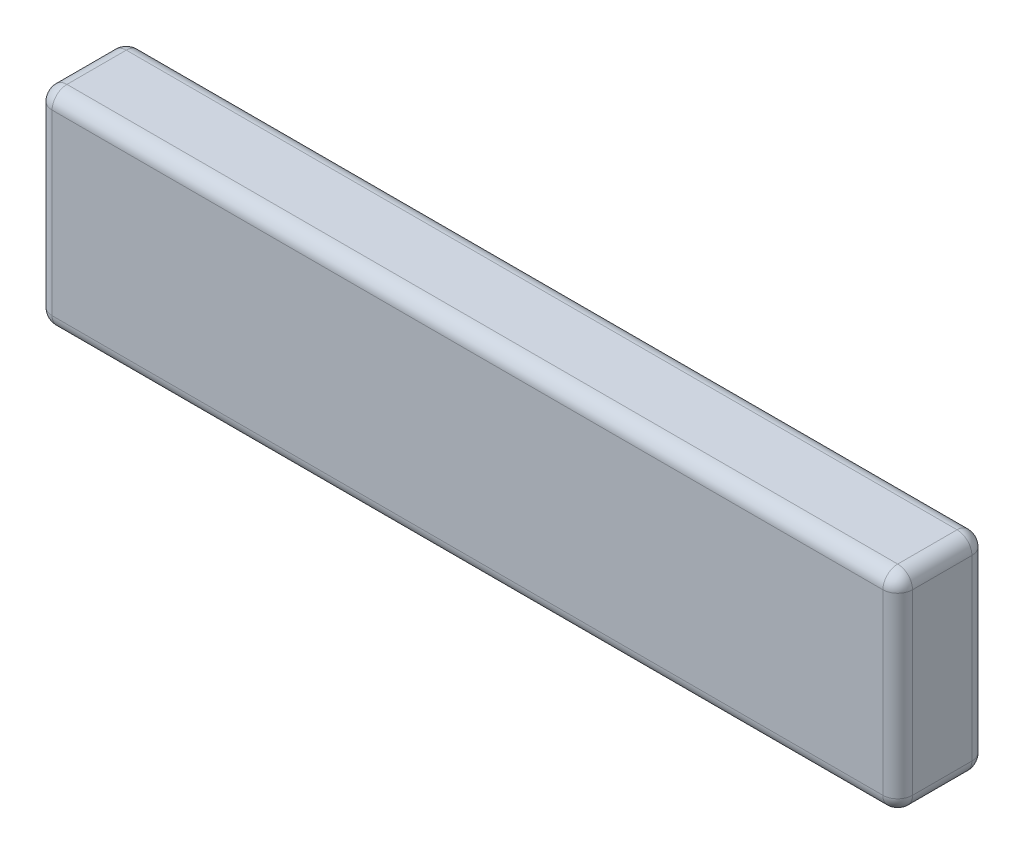
ISO-10303-21;
HEADER;
FILE_DESCRIPTION(('STEP AP214'),'2;1');
FILE_NAME('part.step','',(''),(''),'','','');
FILE_SCHEMA(('AUTOMOTIVE_DESIGN { 1 0 10303 214 1 1 1 1 }'));
ENDSEC;
DATA;
#1=APPLICATION_CONTEXT('core data for automotive mechanical design processes');
#2=APPLICATION_PROTOCOL_DEFINITION('international standard','automotive_design',2000,#1);
#3=PRODUCT_CONTEXT('',#1,'mechanical');
#4=PRODUCT('Part','Part','',(#3));
#5=PRODUCT_RELATED_PRODUCT_CATEGORY('part','',(#4));
#6=PRODUCT_DEFINITION_FORMATION('','',#4);
#7=PRODUCT_DEFINITION_CONTEXT('part definition',#1,'design');
#8=PRODUCT_DEFINITION('design','',#6,#7);
#9=PRODUCT_DEFINITION_SHAPE('','',#8);
#10=(LENGTH_UNIT() NAMED_UNIT(*) SI_UNIT(.MILLI.,.METRE.));
#11=(NAMED_UNIT(*) PLANE_ANGLE_UNIT() SI_UNIT($,.RADIAN.));
#12=(NAMED_UNIT(*) SI_UNIT($,.STERADIAN.) SOLID_ANGLE_UNIT());
#13=UNCERTAINTY_MEASURE_WITH_UNIT(LENGTH_MEASURE(1.E-05),#10,'distance_accuracy_value','');
#14=(GEOMETRIC_REPRESENTATION_CONTEXT(3) GLOBAL_UNCERTAINTY_ASSIGNED_CONTEXT((#13)) GLOBAL_UNIT_ASSIGNED_CONTEXT((#10,
#11,#12)) REPRESENTATION_CONTEXT('',''));
#15=CARTESIAN_POINT('',(0.,0.,0.));
#16=DIRECTION('',(0.,0.,1.));
#17=DIRECTION('',(1.,0.,0.));
#18=AXIS2_PLACEMENT_3D('',#15,#16,#17);
#19=CARTESIAN_POINT('',(11.4400713575457,0.,0.));
#20=DIRECTION('',(1.,0.,0.));
#21=DIRECTION('',(0.,0.,-1.));
#22=AXIS2_PLACEMENT_3D('',#19,#20,#21);
#23=PLANE('',#22);
#24=DIRECTION('',(0.,0.,-1.));
#25=VECTOR('',#24,1.);
#26=CARTESIAN_POINT('',(11.4400713575457,148.074028512687,0.));
#27=LINE('',#26,#25);
#28=CARTESIAN_POINT('',(11.4400713575457,148.074028512687,37.7935567964382));
#29=VERTEX_POINT('',#28);
#30=CARTESIAN_POINT('',(11.4400713575457,148.074028512687,39.7935567964381));
#31=VERTEX_POINT('',#30);
#32=EDGE_CURVE('E50',#29,#31,#27,.F.);
#33=ORIENTED_EDGE('',*,*,#32,.T.);
#34=DIRECTION('',(0.,-1.,0.));
#35=VECTOR('',#34,1.);
#36=CARTESIAN_POINT('',(11.4400713575457,0.,39.7935567964381));
#37=LINE('',#36,#35);
#38=CARTESIAN_POINT('',(11.4400713575457,154.074028512687,39.7935567964381));
#39=VERTEX_POINT('',#38);
#40=EDGE_CURVE('E11',#31,#39,#37,.F.);
#41=ORIENTED_EDGE('',*,*,#40,.T.);
#42=DIRECTION('',(0.,0.,1.));
#43=VECTOR('',#42,1.);
#44=CARTESIAN_POINT('',(11.4400713575457,154.074028512687,0.));
#45=LINE('',#44,#43);
#46=CARTESIAN_POINT('',(11.4400713575457,154.074028512687,37.7935567964382));
#47=VERTEX_POINT('',#46);
#48=EDGE_CURVE('E201',#39,#47,#45,.F.);
#49=ORIENTED_EDGE('',*,*,#48,.T.);
#50=DIRECTION('',(0.,1.,0.));
#51=VECTOR('',#50,1.);
#52=CARTESIAN_POINT('',(11.4400713575457,0.,37.7935567964382));
#53=LINE('',#52,#51);
#54=EDGE_CURVE('E61',#47,#29,#53,.F.);
#55=ORIENTED_EDGE('',*,*,#54,.T.);
#56=EDGE_LOOP('',(#33,#41,#49,#55));
#57=FACE_BOUND('',#56,.T.);
#58=ADVANCED_FACE('F41',(#57),#23,.F.);
#59=CARTESIAN_POINT('',(48.0558444634096,154.574028512687,42.7935567964381));
#60=DIRECTION('',(0.,-1.,0.));
#61=DIRECTION('',(0.,0.,-1.));
#62=AXIS2_PLACEMENT_3D('',#59,#60,#61);
#63=PLANE('',#62);
#64=DIRECTION('',(-1.,0.,0.));
#65=VECTOR('',#64,1.);
#66=CARTESIAN_POINT('',(48.0558444634096,154.574028512687,39.7935567964381));
#67=LINE('',#66,#65);
#68=CARTESIAN_POINT('',(11.9400713575457,154.574028512687,39.7935567964381));
#69=VERTEX_POINT('',#68);
#70=CARTESIAN_POINT('',(39.9400713575457,154.574028512687,39.7935567964381));
#71=VERTEX_POINT('',#70);
#72=EDGE_CURVE('E182',#69,#71,#67,.F.);
#73=ORIENTED_EDGE('',*,*,#72,.T.);
#74=DIRECTION('',(0.,0.,-1.));
#75=VECTOR('',#74,1.);
#76=CARTESIAN_POINT('',(39.9400713575457,154.574028512687,42.7935567964381));
#77=LINE('',#76,#75);
#78=CARTESIAN_POINT('',(39.9400713575457,154.574028512687,37.7935567964382));
#79=VERTEX_POINT('',#78);
#80=EDGE_CURVE('E211',#71,#79,#77,.T.);
#81=ORIENTED_EDGE('',*,*,#80,.T.);
#82=DIRECTION('',(-1.,0.,0.));
#83=VECTOR('',#82,1.);
#84=CARTESIAN_POINT('',(48.0558444634096,154.574028512687,37.7935567964382));
#85=LINE('',#84,#83);
#86=CARTESIAN_POINT('',(11.9400713575457,154.574028512687,37.7935567964382));
#87=VERTEX_POINT('',#86);
#88=EDGE_CURVE('E251',#79,#87,#85,.T.);
#89=ORIENTED_EDGE('',*,*,#88,.T.);
#90=DIRECTION('',(0.,0.,1.));
#91=VECTOR('',#90,1.);
#92=CARTESIAN_POINT('',(11.9400713575457,154.574028512687,42.7935567964381));
#93=LINE('',#92,#91);
#94=EDGE_CURVE('E213',#87,#69,#93,.T.);
#95=ORIENTED_EDGE('',*,*,#94,.T.);
#96=EDGE_LOOP('',(#73,#81,#89,#95));
#97=FACE_BOUND('',#96,.T.);
#98=ADVANCED_FACE('F258',(#97),#63,.F.);
#99=CARTESIAN_POINT('',(48.0558444634096,-16.4259714873127,37.2935567964382));
#100=DIRECTION('',(0.,0.,1.));
#101=DIRECTION('',(1.,0.,0.));
#102=AXIS2_PLACEMENT_3D('',#99,#100,#101);
#103=PLANE('',#102);
#104=DIRECTION('',(-1.,0.,0.));
#105=VECTOR('',#104,1.);
#106=CARTESIAN_POINT('',(48.0558444634096,154.074028512687,37.2935567964382));
#107=LINE('',#106,#105);
#108=CARTESIAN_POINT('',(11.9400713575457,154.074028512687,37.2935567964382));
#109=VERTEX_POINT('',#108);
#110=CARTESIAN_POINT('',(39.9400713575457,154.074028512687,37.2935567964382));
#111=VERTEX_POINT('',#110);
#112=EDGE_CURVE('E246',#109,#111,#107,.F.);
#113=ORIENTED_EDGE('',*,*,#112,.T.);
#114=DIRECTION('',(0.,-1.,0.));
#115=VECTOR('',#114,1.);
#116=CARTESIAN_POINT('',(39.9400713575457,-16.4259714873127,37.2935567964382));
#117=LINE('',#116,#115);
#118=CARTESIAN_POINT('',(39.9400713575457,148.074028512687,37.2935567964382));
#119=VERTEX_POINT('',#118);
#120=EDGE_CURVE('E203',#111,#119,#117,.T.);
#121=ORIENTED_EDGE('',*,*,#120,.T.);
#122=DIRECTION('',(-1.,0.,0.));
#123=VECTOR('',#122,1.);
#124=CARTESIAN_POINT('',(48.0558444634096,148.074028512687,37.2935567964382));
#125=LINE('',#124,#123);
#126=CARTESIAN_POINT('',(11.9400713575457,148.074028512687,37.2935567964382));
#127=VERTEX_POINT('',#126);
#128=EDGE_CURVE('E249',#119,#127,#125,.T.);
#129=ORIENTED_EDGE('',*,*,#128,.T.);
#130=DIRECTION('',(0.,1.,0.));
#131=VECTOR('',#130,1.);
#132=CARTESIAN_POINT('',(11.9400713575457,-16.4259714873127,37.2935567964382));
#133=LINE('',#132,#131);
#134=EDGE_CURVE('E205',#127,#109,#133,.T.);
#135=ORIENTED_EDGE('',*,*,#134,.T.);
#136=EDGE_LOOP('',(#113,#121,#129,#135));
#137=FACE_BOUND('',#136,.T.);
#138=ADVANCED_FACE('F283',(#137),#103,.F.);
#139=CARTESIAN_POINT('',(48.0558444634096,147.574028512687,42.7935567964381));
#140=DIRECTION('',(0.,1.,0.));
#141=DIRECTION('',(0.,0.,1.));
#142=AXIS2_PLACEMENT_3D('',#139,#140,#141);
#143=PLANE('',#142);
#144=DIRECTION('',(-1.,0.,0.));
#145=VECTOR('',#144,1.);
#146=CARTESIAN_POINT('',(48.0558444634096,147.574028512687,37.7935567964382));
#147=LINE('',#146,#145);
#148=CARTESIAN_POINT('',(11.9400713575457,147.574028512687,37.7935567964382));
#149=VERTEX_POINT('',#148);
#150=CARTESIAN_POINT('',(39.9400713575457,147.574028512687,37.7935567964382));
#151=VERTEX_POINT('',#150);
#152=EDGE_CURVE('E134',#149,#151,#147,.F.);
#153=ORIENTED_EDGE('',*,*,#152,.T.);
#154=DIRECTION('',(0.,0.,1.));
#155=VECTOR('',#154,1.);
#156=CARTESIAN_POINT('',(39.9400713575457,147.574028512687,42.7935567964381));
#157=LINE('',#156,#155);
#158=CARTESIAN_POINT('',(39.9400713575457,147.574028512687,39.7935567964381));
#159=VERTEX_POINT('',#158);
#160=EDGE_CURVE('E140',#151,#159,#157,.T.);
#161=ORIENTED_EDGE('',*,*,#160,.T.);
#162=DIRECTION('',(-1.,0.,0.));
#163=VECTOR('',#162,1.);
#164=CARTESIAN_POINT('',(48.0558444634096,147.574028512687,39.7935567964381));
#165=LINE('',#164,#163);
#166=CARTESIAN_POINT('',(11.9400713575457,147.574028512687,39.7935567964381));
#167=VERTEX_POINT('',#166);
#168=EDGE_CURVE('E136',#159,#167,#165,.T.);
#169=ORIENTED_EDGE('',*,*,#168,.T.);
#170=DIRECTION('',(0.,0.,-1.));
#171=VECTOR('',#170,1.);
#172=CARTESIAN_POINT('',(11.9400713575457,147.574028512687,42.7935567964381));
#173=LINE('',#172,#171);
#174=EDGE_CURVE('E131',#167,#149,#173,.T.);
#175=ORIENTED_EDGE('',*,*,#174,.T.);
#176=EDGE_LOOP('',(#153,#161,#169,#175));
#177=FACE_BOUND('',#176,.T.);
#178=ADVANCED_FACE('F133',(#177),#143,.F.);
#179=CARTESIAN_POINT('',(48.0558444634096,-16.4259714873127,40.2935567964381));
#180=DIRECTION('',(0.,0.,-1.));
#181=DIRECTION('',(-1.,0.,0.));
#182=AXIS2_PLACEMENT_3D('',#179,#180,#181);
#183=PLANE('',#182);
#184=DIRECTION('',(-1.,0.,0.));
#185=VECTOR('',#184,1.);
#186=CARTESIAN_POINT('',(48.0558444634096,148.074028512687,40.2935567964381));
#187=LINE('',#186,#185);
#188=CARTESIAN_POINT('',(11.9400713575457,148.074028512687,40.2935567964381));
#189=VERTEX_POINT('',#188);
#190=CARTESIAN_POINT('',(39.9400713575457,148.074028512687,40.2935567964381));
#191=VERTEX_POINT('',#190);
#192=EDGE_CURVE('E243',#189,#191,#187,.F.);
#193=ORIENTED_EDGE('',*,*,#192,.T.);
#194=DIRECTION('',(0.,1.,0.));
#195=VECTOR('',#194,1.);
#196=CARTESIAN_POINT('',(39.9400713575457,-16.4259714873127,40.2935567964381));
#197=LINE('',#196,#195);
#198=CARTESIAN_POINT('',(39.9400713575457,154.074028512687,40.2935567964381));
#199=VERTEX_POINT('',#198);
#200=EDGE_CURVE('E220',#191,#199,#197,.T.);
#201=ORIENTED_EDGE('',*,*,#200,.T.);
#202=DIRECTION('',(-1.,0.,0.));
#203=VECTOR('',#202,1.);
#204=CARTESIAN_POINT('',(48.0558444634096,154.074028512687,40.2935567964381));
#205=LINE('',#204,#203);
#206=CARTESIAN_POINT('',(11.9400713575457,154.074028512687,40.2935567964381));
#207=VERTEX_POINT('',#206);
#208=EDGE_CURVE('E240',#199,#207,#205,.T.);
#209=ORIENTED_EDGE('',*,*,#208,.T.);
#210=DIRECTION('',(0.,-1.,0.));
#211=VECTOR('',#210,1.);
#212=CARTESIAN_POINT('',(11.9400713575457,-16.4259714873127,40.2935567964381));
#213=LINE('',#212,#211);
#214=EDGE_CURVE('E222',#207,#189,#213,.T.);
#215=ORIENTED_EDGE('',*,*,#214,.T.);
#216=EDGE_LOOP('',(#193,#201,#209,#215));
#217=FACE_BOUND('',#216,.T.);
#218=ADVANCED_FACE('F305',(#217),#183,.F.);
#219=CARTESIAN_POINT('',(40.4400713575457,-16.4259714873127,42.7935567964381));
#220=DIRECTION('',(-1.,0.,0.));
#221=DIRECTION('',(0.,0.,1.));
#222=AXIS2_PLACEMENT_3D('',#219,#220,#221);
#223=PLANE('',#222);
#224=DIRECTION('',(0.,1.,0.));
#225=VECTOR('',#224,1.);
#226=CARTESIAN_POINT('',(40.4400713575457,-16.4259714873127,39.7935567964381));
#227=LINE('',#226,#225);
#228=CARTESIAN_POINT('',(40.4400713575457,154.074028512687,39.7935567964381));
#229=VERTEX_POINT('',#228);
#230=CARTESIAN_POINT('',(40.4400713575457,148.074028512687,39.7935567964381));
#231=VERTEX_POINT('',#230);
#232=EDGE_CURVE('E231',#229,#231,#227,.F.);
#233=ORIENTED_EDGE('',*,*,#232,.T.);
#234=DIRECTION('',(0.,0.,1.));
#235=VECTOR('',#234,1.);
#236=CARTESIAN_POINT('',(40.4400713575457,148.074028512687,42.7935567964381));
#237=LINE('',#236,#235);
#238=CARTESIAN_POINT('',(40.4400713575457,148.074028512687,37.7935567964382));
#239=VERTEX_POINT('',#238);
#240=EDGE_CURVE('E228',#231,#239,#237,.F.);
#241=ORIENTED_EDGE('',*,*,#240,.T.);
#242=DIRECTION('',(0.,-1.,0.));
#243=VECTOR('',#242,1.);
#244=CARTESIAN_POINT('',(40.4400713575457,-16.4259714873127,37.7935567964382));
#245=LINE('',#244,#243);
#246=CARTESIAN_POINT('',(40.4400713575457,154.074028512687,37.7935567964382));
#247=VERTEX_POINT('',#246);
#248=EDGE_CURVE('E235',#239,#247,#245,.F.);
#249=ORIENTED_EDGE('',*,*,#248,.T.);
#250=DIRECTION('',(0.,0.,-1.));
#251=VECTOR('',#250,1.);
#252=CARTESIAN_POINT('',(40.4400713575457,154.074028512687,42.7935567964381));
#253=LINE('',#252,#251);
#254=EDGE_CURVE('E233',#247,#229,#253,.F.);
#255=ORIENTED_EDGE('',*,*,#254,.T.);
#256=EDGE_LOOP('',(#233,#241,#249,#255));
#257=FACE_BOUND('',#256,.T.);
#258=ADVANCED_FACE('F321',(#257),#223,.F.);
#259=CARTESIAN_POINT('',(48.0558444634096,154.074028512687,37.7935567964382));
#260=DIRECTION('',(-1.,0.,0.));
#261=DIRECTION('',(0.,0.,1.));
#262=AXIS2_PLACEMENT_3D('',#259,#260,#261);
#263=CYLINDRICAL_SURFACE('',#262,0.5);
#264=ORIENTED_EDGE('',*,*,#88,.F.);
#265=CARTESIAN_POINT('',(39.9400713575457,154.074028512687,37.7935567964382));
#266=DIRECTION('',(-1.,0.,0.));
#267=DIRECTION('',(0.,0.,1.));
#268=AXIS2_PLACEMENT_3D('',#265,#266,#267);
#269=CIRCLE('',#268,0.5);
#270=EDGE_CURVE('E207',#79,#111,#269,.T.);
#271=ORIENTED_EDGE('',*,*,#270,.T.);
#272=ORIENTED_EDGE('',*,*,#112,.F.);
#273=CARTESIAN_POINT('',(11.9400713575457,154.074028512687,37.7935567964382));
#274=DIRECTION('',(-1.,0.,0.));
#275=DIRECTION('',(0.,0.,1.));
#276=AXIS2_PLACEMENT_3D('',#273,#274,#275);
#277=CIRCLE('',#276,0.5);
#278=EDGE_CURVE('E209',#109,#87,#277,.F.);
#279=ORIENTED_EDGE('',*,*,#278,.T.);
#280=EDGE_LOOP('',(#264,#271,#272,#279));
#281=FACE_BOUND('',#280,.T.);
#282=ADVANCED_FACE('F280',(#281),#263,.T.);
#283=CARTESIAN_POINT('',(48.0558444634096,154.074028512687,39.7935567964381));
#284=DIRECTION('',(-1.,0.,0.));
#285=DIRECTION('',(0.,0.,1.));
#286=AXIS2_PLACEMENT_3D('',#283,#284,#285);
#287=CYLINDRICAL_SURFACE('',#286,0.5);
#288=ORIENTED_EDGE('',*,*,#208,.F.);
#289=CARTESIAN_POINT('',(39.9400713575457,154.074028512687,39.7935567964381));
#290=DIRECTION('',(-1.,0.,0.));
#291=DIRECTION('',(0.,0.,1.));
#292=AXIS2_PLACEMENT_3D('',#289,#290,#291);
#293=CIRCLE('',#292,0.5);
#294=EDGE_CURVE('E215',#199,#71,#293,.T.);
#295=ORIENTED_EDGE('',*,*,#294,.T.);
#296=ORIENTED_EDGE('',*,*,#72,.F.);
#297=CARTESIAN_POINT('',(11.9400713575457,154.074028512687,39.7935567964381));
#298=DIRECTION('',(-1.,0.,0.));
#299=DIRECTION('',(0.,0.,1.));
#300=AXIS2_PLACEMENT_3D('',#297,#298,#299);
#301=CIRCLE('',#300,0.5);
#302=EDGE_CURVE('E217',#69,#207,#301,.F.);
#303=ORIENTED_EDGE('',*,*,#302,.T.);
#304=EDGE_LOOP('',(#288,#295,#296,#303));
#305=FACE_BOUND('',#304,.T.);
#306=ADVANCED_FACE('F304',(#305),#287,.T.);
#307=CARTESIAN_POINT('',(48.0558444634096,148.074028512687,37.7935567964382));
#308=DIRECTION('',(-1.,0.,0.));
#309=DIRECTION('',(0.,0.,1.));
#310=AXIS2_PLACEMENT_3D('',#307,#308,#309);
#311=CYLINDRICAL_SURFACE('',#310,0.5);
#312=ORIENTED_EDGE('',*,*,#128,.F.);
#313=CARTESIAN_POINT('',(39.9400713575457,148.074028512687,37.7935567964382));
#314=DIRECTION('',(-1.,0.,0.));
#315=DIRECTION('',(0.,0.,1.));
#316=AXIS2_PLACEMENT_3D('',#313,#314,#315);
#317=CIRCLE('',#316,0.5);
#318=EDGE_CURVE('E141',#119,#151,#317,.T.);
#319=ORIENTED_EDGE('',*,*,#318,.T.);
#320=ORIENTED_EDGE('',*,*,#152,.F.);
#321=CARTESIAN_POINT('',(11.9400713575457,148.074028512687,37.7935567964382));
#322=DIRECTION('',(-1.,0.,0.));
#323=DIRECTION('',(0.,0.,1.));
#324=AXIS2_PLACEMENT_3D('',#321,#322,#323);
#325=CIRCLE('',#324,0.5);
#326=EDGE_CURVE('E148',#149,#127,#325,.F.);
#327=ORIENTED_EDGE('',*,*,#326,.T.);
#328=EDGE_LOOP('',(#312,#319,#320,#327));
#329=FACE_BOUND('',#328,.T.);
#330=ADVANCED_FACE('F147',(#329),#311,.T.);
#331=CARTESIAN_POINT('',(48.0558444634096,148.074028512687,39.7935567964381));
#332=DIRECTION('',(-1.,0.,0.));
#333=DIRECTION('',(0.,0.,1.));
#334=AXIS2_PLACEMENT_3D('',#331,#332,#333);
#335=CYLINDRICAL_SURFACE('',#334,0.5);
#336=ORIENTED_EDGE('',*,*,#168,.F.);
#337=CARTESIAN_POINT('',(39.9400713575457,148.074028512687,39.7935567964381));
#338=DIRECTION('',(-1.,0.,0.));
#339=DIRECTION('',(0.,0.,1.));
#340=AXIS2_PLACEMENT_3D('',#337,#338,#339);
#341=CIRCLE('',#340,0.5);
#342=EDGE_CURVE('E224',#159,#191,#341,.T.);
#343=ORIENTED_EDGE('',*,*,#342,.T.);
#344=ORIENTED_EDGE('',*,*,#192,.F.);
#345=CARTESIAN_POINT('',(11.9400713575457,148.074028512687,39.7935567964381));
#346=DIRECTION('',(-1.,0.,0.));
#347=DIRECTION('',(0.,0.,1.));
#348=AXIS2_PLACEMENT_3D('',#345,#346,#347);
#349=CIRCLE('',#348,0.5);
#350=EDGE_CURVE('E226',#189,#167,#349,.F.);
#351=ORIENTED_EDGE('',*,*,#350,.T.);
#352=EDGE_LOOP('',(#336,#343,#344,#351));
#353=FACE_BOUND('',#352,.T.);
#354=ADVANCED_FACE('F328',(#353),#335,.T.);
#355=CARTESIAN_POINT('',(39.9400713575457,154.074028512687,39.7935567964381));
#356=DIRECTION('',(-1.,0.,0.));
#357=DIRECTION('',(0.,0.,1.));
#358=AXIS2_PLACEMENT_3D('',#355,#356,#357);
#359=SPHERICAL_SURFACE('',#358,0.5);
#360=CARTESIAN_POINT('',(39.9400713575457,154.074028512687,39.7935567964381));
#361=DIRECTION('',(0.,0.,-1.));
#362=DIRECTION('',(-1.,0.,0.));
#363=AXIS2_PLACEMENT_3D('',#360,#361,#362);
#364=CIRCLE('',#363,0.5);
#365=EDGE_CURVE('E183',#71,#229,#364,.T.);
#366=ORIENTED_EDGE('',*,*,#365,.F.);
#367=ORIENTED_EDGE('',*,*,#294,.F.);
#368=CARTESIAN_POINT('',(39.9400713575457,154.074028512687,39.7935567964381));
#369=DIRECTION('',(0.,-1.,0.));
#370=DIRECTION('',(0.,0.,-1.));
#371=AXIS2_PLACEMENT_3D('',#368,#369,#370);
#372=CIRCLE('',#371,0.5);
#373=EDGE_CURVE('E179',#229,#199,#372,.T.);
#374=ORIENTED_EDGE('',*,*,#373,.F.);
#375=EDGE_LOOP('',(#366,#367,#374));
#376=FACE_BOUND('',#375,.T.);
#377=ADVANCED_FACE('F267',(#376),#359,.T.);
#378=CARTESIAN_POINT('',(39.9400713575457,-16.4259714873127,39.7935567964381));
#379=DIRECTION('',(0.,1.,0.));
#380=DIRECTION('',(0.,0.,1.));
#381=AXIS2_PLACEMENT_3D('',#378,#379,#380);
#382=CYLINDRICAL_SURFACE('',#381,0.5);
#383=ORIENTED_EDGE('',*,*,#373,.T.);
#384=ORIENTED_EDGE('',*,*,#200,.F.);
#385=CARTESIAN_POINT('',(39.9400713575457,148.074028512687,39.7935567964381));
#386=DIRECTION('',(0.,-1.,0.));
#387=DIRECTION('',(0.,0.,-1.));
#388=AXIS2_PLACEMENT_3D('',#385,#386,#387);
#389=CIRCLE('',#388,0.5);
#390=EDGE_CURVE('E186',#231,#191,#389,.T.);
#391=ORIENTED_EDGE('',*,*,#390,.F.);
#392=ORIENTED_EDGE('',*,*,#232,.F.);
#393=EDGE_LOOP('',(#383,#384,#391,#392));
#394=FACE_BOUND('',#393,.T.);
#395=ADVANCED_FACE('F309',(#394),#382,.T.);
#396=CARTESIAN_POINT('',(39.9400713575457,154.074028512687,42.7935567964381));
#397=DIRECTION('',(0.,0.,-1.));
#398=DIRECTION('',(-1.,0.,0.));
#399=AXIS2_PLACEMENT_3D('',#396,#397,#398);
#400=CYLINDRICAL_SURFACE('',#399,0.5);
#401=ORIENTED_EDGE('',*,*,#365,.T.);
#402=ORIENTED_EDGE('',*,*,#254,.F.);
#403=CARTESIAN_POINT('',(39.9400713575457,154.074028512687,37.7935567964382));
#404=DIRECTION('',(0.,0.,-1.));
#405=DIRECTION('',(-1.,0.,0.));
#406=AXIS2_PLACEMENT_3D('',#403,#404,#405);
#407=CIRCLE('',#406,0.5);
#408=EDGE_CURVE('E189',#79,#247,#407,.T.);
#409=ORIENTED_EDGE('',*,*,#408,.F.);
#410=ORIENTED_EDGE('',*,*,#80,.F.);
#411=EDGE_LOOP('',(#401,#402,#409,#410));
#412=FACE_BOUND('',#411,.T.);
#413=ADVANCED_FACE('F272',(#412),#400,.T.);
#414=CARTESIAN_POINT('',(39.9400713575457,148.074028512687,39.7935567964381));
#415=DIRECTION('',(-1.,0.,0.));
#416=DIRECTION('',(0.,0.,1.));
#417=AXIS2_PLACEMENT_3D('',#414,#415,#416);
#418=SPHERICAL_SURFACE('',#417,0.5);
#419=ORIENTED_EDGE('',*,*,#390,.T.);
#420=ORIENTED_EDGE('',*,*,#342,.F.);
#421=CARTESIAN_POINT('',(39.9400713575457,148.074028512687,39.7935567964381));
#422=DIRECTION('',(0.,0.,-1.));
#423=DIRECTION('',(-1.,0.,0.));
#424=AXIS2_PLACEMENT_3D('',#421,#422,#423);
#425=CIRCLE('',#424,0.5);
#426=EDGE_CURVE('E192',#231,#159,#425,.T.);
#427=ORIENTED_EDGE('',*,*,#426,.F.);
#428=EDGE_LOOP('',(#419,#420,#427));
#429=FACE_BOUND('',#428,.T.);
#430=ADVANCED_FACE('F313',(#429),#418,.T.);
#431=CARTESIAN_POINT('',(39.9400713575457,154.074028512687,37.7935567964382));
#432=DIRECTION('',(-1.,0.,0.));
#433=DIRECTION('',(0.,0.,1.));
#434=AXIS2_PLACEMENT_3D('',#431,#432,#433);
#435=SPHERICAL_SURFACE('',#434,0.5);
#436=ORIENTED_EDGE('',*,*,#270,.F.);
#437=ORIENTED_EDGE('',*,*,#408,.T.);
#438=CARTESIAN_POINT('',(39.9400713575457,154.074028512687,37.7935567964382));
#439=DIRECTION('',(0.,-1.,0.));
#440=DIRECTION('',(0.,0.,-1.));
#441=AXIS2_PLACEMENT_3D('',#438,#439,#440);
#442=CIRCLE('',#441,0.5);
#443=EDGE_CURVE('E195',#111,#247,#442,.T.);
#444=ORIENTED_EDGE('',*,*,#443,.F.);
#445=EDGE_LOOP('',(#436,#437,#444));
#446=FACE_BOUND('',#445,.T.);
#447=ADVANCED_FACE('F276',(#446),#435,.T.);
#448=CARTESIAN_POINT('',(39.9400713575457,148.074028512687,42.7935567964381));
#449=DIRECTION('',(0.,0.,1.));
#450=DIRECTION('',(1.,0.,0.));
#451=AXIS2_PLACEMENT_3D('',#448,#449,#450);
#452=CYLINDRICAL_SURFACE('',#451,0.5);
#453=ORIENTED_EDGE('',*,*,#426,.T.);
#454=ORIENTED_EDGE('',*,*,#160,.F.);
#455=CARTESIAN_POINT('',(39.9400713575457,148.074028512687,37.7935567964382));
#456=DIRECTION('',(0.,0.,-1.));
#457=DIRECTION('',(-1.,0.,0.));
#458=AXIS2_PLACEMENT_3D('',#455,#456,#457);
#459=CIRCLE('',#458,0.5);
#460=EDGE_CURVE('E160',#239,#151,#459,.T.);
#461=ORIENTED_EDGE('',*,*,#460,.F.);
#462=ORIENTED_EDGE('',*,*,#240,.F.);
#463=EDGE_LOOP('',(#453,#454,#461,#462));
#464=FACE_BOUND('',#463,.T.);
#465=ADVANCED_FACE('F318',(#464),#452,.T.);
#466=CARTESIAN_POINT('',(39.9400713575457,-16.4259714873127,37.7935567964382));
#467=DIRECTION('',(0.,-1.,0.));
#468=DIRECTION('',(0.,0.,-1.));
#469=AXIS2_PLACEMENT_3D('',#466,#467,#468);
#470=CYLINDRICAL_SURFACE('',#469,0.5);
#471=ORIENTED_EDGE('',*,*,#443,.T.);
#472=ORIENTED_EDGE('',*,*,#248,.F.);
#473=CARTESIAN_POINT('',(39.9400713575457,148.074028512687,37.7935567964382));
#474=DIRECTION('',(0.,-1.,0.));
#475=DIRECTION('',(0.,0.,-1.));
#476=AXIS2_PLACEMENT_3D('',#473,#474,#475);
#477=CIRCLE('',#476,0.5);
#478=EDGE_CURVE('E159',#119,#239,#477,.T.);
#479=ORIENTED_EDGE('',*,*,#478,.F.);
#480=ORIENTED_EDGE('',*,*,#120,.F.);
#481=EDGE_LOOP('',(#471,#472,#479,#480));
#482=FACE_BOUND('',#481,.T.);
#483=ADVANCED_FACE('F324',(#482),#470,.T.);
#484=CARTESIAN_POINT('',(39.9400713575457,148.074028512687,37.7935567964382));
#485=DIRECTION('',(-1.,0.,0.));
#486=DIRECTION('',(0.,0.,1.));
#487=AXIS2_PLACEMENT_3D('',#484,#485,#486);
#488=SPHERICAL_SURFACE('',#487,0.5);
#489=ORIENTED_EDGE('',*,*,#460,.T.);
#490=ORIENTED_EDGE('',*,*,#318,.F.);
#491=ORIENTED_EDGE('',*,*,#478,.T.);
#492=EDGE_LOOP('',(#489,#490,#491));
#493=FACE_BOUND('',#492,.T.);
#494=ADVANCED_FACE('F326',(#493),#488,.T.);
#495=CARTESIAN_POINT('',(11.9400713575457,148.074028512687,37.7935567964382));
#496=DIRECTION('',(1.,0.,0.));
#497=DIRECTION('',(0.,0.,-1.));
#498=AXIS2_PLACEMENT_3D('',#495,#496,#497);
#499=SPHERICAL_SURFACE('',#498,0.5);
#500=CARTESIAN_POINT('',(11.9400713575457,148.074028512687,37.7935567964382));
#501=DIRECTION('',(0.,1.,0.));
#502=DIRECTION('',(0.,0.,1.));
#503=AXIS2_PLACEMENT_3D('',#500,#501,#502);
#504=CIRCLE('',#503,0.5);
#505=EDGE_CURVE('E155',#127,#29,#504,.T.);
#506=ORIENTED_EDGE('',*,*,#505,.F.);
#507=ORIENTED_EDGE('',*,*,#326,.F.);
#508=CARTESIAN_POINT('',(11.9400713575457,148.074028512687,37.7935567964382));
#509=DIRECTION('',(0.,0.,1.));
#510=DIRECTION('',(1.,0.,0.));
#511=AXIS2_PLACEMENT_3D('',#508,#509,#510);
#512=CIRCLE('',#511,0.5);
#513=EDGE_CURVE('E45',#29,#149,#512,.T.);
#514=ORIENTED_EDGE('',*,*,#513,.F.);
#515=EDGE_LOOP('',(#506,#507,#514));
#516=FACE_BOUND('',#515,.T.);
#517=ADVANCED_FACE('F43',(#516),#499,.T.);
#518=CARTESIAN_POINT('',(11.9400713575457,148.074028512687,42.7935567964381));
#519=DIRECTION('',(0.,0.,-1.));
#520=DIRECTION('',(-1.,0.,0.));
#521=AXIS2_PLACEMENT_3D('',#518,#519,#520);
#522=CYLINDRICAL_SURFACE('',#521,0.5);
#523=ORIENTED_EDGE('',*,*,#513,.T.);
#524=ORIENTED_EDGE('',*,*,#174,.F.);
#525=CARTESIAN_POINT('',(11.9400713575457,148.074028512687,39.7935567964381));
#526=DIRECTION('',(0.,0.,1.));
#527=DIRECTION('',(1.,0.,0.));
#528=AXIS2_PLACEMENT_3D('',#525,#526,#527);
#529=CIRCLE('',#528,0.5);
#530=EDGE_CURVE('E162',#31,#167,#529,.T.);
#531=ORIENTED_EDGE('',*,*,#530,.F.);
#532=ORIENTED_EDGE('',*,*,#32,.F.);
#533=EDGE_LOOP('',(#523,#524,#531,#532));
#534=FACE_BOUND('',#533,.T.);
#535=ADVANCED_FACE('F158',(#534),#522,.T.);
#536=CARTESIAN_POINT('',(11.9400713575457,-16.4259714873127,37.7935567964382));
#537=DIRECTION('',(0.,1.,0.));
#538=DIRECTION('',(0.,0.,1.));
#539=AXIS2_PLACEMENT_3D('',#536,#537,#538);
#540=CYLINDRICAL_SURFACE('',#539,0.5);
#541=ORIENTED_EDGE('',*,*,#505,.T.);
#542=ORIENTED_EDGE('',*,*,#54,.F.);
#543=CARTESIAN_POINT('',(11.9400713575457,154.074028512687,37.7935567964382));
#544=DIRECTION('',(0.,1.,0.));
#545=DIRECTION('',(0.,0.,1.));
#546=AXIS2_PLACEMENT_3D('',#543,#544,#545);
#547=CIRCLE('',#546,0.5);
#548=EDGE_CURVE('E164',#109,#47,#547,.T.);
#549=ORIENTED_EDGE('',*,*,#548,.F.);
#550=ORIENTED_EDGE('',*,*,#134,.F.);
#551=EDGE_LOOP('',(#541,#542,#549,#550));
#552=FACE_BOUND('',#551,.T.);
#553=ADVANCED_FACE('F284',(#552),#540,.T.);
#554=CARTESIAN_POINT('',(11.9400713575457,148.074028512687,39.7935567964381));
#555=DIRECTION('',(1.,0.,0.));
#556=DIRECTION('',(0.,0.,-1.));
#557=AXIS2_PLACEMENT_3D('',#554,#555,#556);
#558=SPHERICAL_SURFACE('',#557,0.5);
#559=ORIENTED_EDGE('',*,*,#530,.T.);
#560=ORIENTED_EDGE('',*,*,#350,.F.);
#561=CARTESIAN_POINT('',(11.9400713575457,148.074028512687,39.7935567964381));
#562=DIRECTION('',(0.,1.,0.));
#563=DIRECTION('',(0.,0.,1.));
#564=AXIS2_PLACEMENT_3D('',#561,#562,#563);
#565=CIRCLE('',#564,0.5);
#566=EDGE_CURVE('E169',#31,#189,#565,.T.);
#567=ORIENTED_EDGE('',*,*,#566,.F.);
#568=EDGE_LOOP('',(#559,#560,#567));
#569=FACE_BOUND('',#568,.T.);
#570=ADVANCED_FACE('F331',(#569),#558,.T.);
#571=CARTESIAN_POINT('',(11.9400713575457,154.074028512687,37.7935567964382));
#572=DIRECTION('',(1.,0.,0.));
#573=DIRECTION('',(0.,0.,-1.));
#574=AXIS2_PLACEMENT_3D('',#571,#572,#573);
#575=SPHERICAL_SURFACE('',#574,0.5);
#576=ORIENTED_EDGE('',*,*,#278,.F.);
#577=ORIENTED_EDGE('',*,*,#548,.T.);
#578=CARTESIAN_POINT('',(11.9400713575457,154.074028512687,37.7935567964382));
#579=DIRECTION('',(0.,0.,1.));
#580=DIRECTION('',(1.,0.,0.));
#581=AXIS2_PLACEMENT_3D('',#578,#579,#580);
#582=CIRCLE('',#581,0.5);
#583=EDGE_CURVE('E172',#87,#47,#582,.T.);
#584=ORIENTED_EDGE('',*,*,#583,.F.);
#585=EDGE_LOOP('',(#576,#577,#584));
#586=FACE_BOUND('',#585,.T.);
#587=ADVANCED_FACE('F288',(#586),#575,.T.);
#588=CARTESIAN_POINT('',(11.9400713575457,-16.4259714873127,39.7935567964381));
#589=DIRECTION('',(0.,-1.,0.));
#590=DIRECTION('',(0.,0.,-1.));
#591=AXIS2_PLACEMENT_3D('',#588,#589,#590);
#592=CYLINDRICAL_SURFACE('',#591,0.5);
#593=ORIENTED_EDGE('',*,*,#566,.T.);
#594=ORIENTED_EDGE('',*,*,#214,.F.);
#595=CARTESIAN_POINT('',(11.9400713575457,154.074028512687,39.7935567964381));
#596=DIRECTION('',(0.,1.,0.));
#597=DIRECTION('',(0.,0.,1.));
#598=AXIS2_PLACEMENT_3D('',#595,#596,#597);
#599=CIRCLE('',#598,0.5);
#600=EDGE_CURVE('E175',#39,#207,#599,.T.);
#601=ORIENTED_EDGE('',*,*,#600,.F.);
#602=ORIENTED_EDGE('',*,*,#40,.F.);
#603=EDGE_LOOP('',(#593,#594,#601,#602));
#604=FACE_BOUND('',#603,.T.);
#605=ADVANCED_FACE('F299',(#604),#592,.T.);
#606=CARTESIAN_POINT('',(11.9400713575457,154.074028512687,42.7935567964381));
#607=DIRECTION('',(0.,0.,1.));
#608=DIRECTION('',(1.,0.,0.));
#609=AXIS2_PLACEMENT_3D('',#606,#607,#608);
#610=CYLINDRICAL_SURFACE('',#609,0.5);
#611=ORIENTED_EDGE('',*,*,#583,.T.);
#612=ORIENTED_EDGE('',*,*,#48,.F.);
#613=CARTESIAN_POINT('',(11.9400713575457,154.074028512687,39.7935567964381));
#614=DIRECTION('',(0.,0.,1.));
#615=DIRECTION('',(1.,0.,0.));
#616=AXIS2_PLACEMENT_3D('',#613,#614,#615);
#617=CIRCLE('',#616,0.5);
#618=EDGE_CURVE('E177',#69,#39,#617,.T.);
#619=ORIENTED_EDGE('',*,*,#618,.F.);
#620=ORIENTED_EDGE('',*,*,#94,.F.);
#621=EDGE_LOOP('',(#611,#612,#619,#620));
#622=FACE_BOUND('',#621,.T.);
#623=ADVANCED_FACE('F292',(#622),#610,.T.);
#624=CARTESIAN_POINT('',(11.9400713575457,154.074028512687,39.7935567964381));
#625=DIRECTION('',(1.,0.,0.));
#626=DIRECTION('',(0.,0.,-1.));
#627=AXIS2_PLACEMENT_3D('',#624,#625,#626);
#628=SPHERICAL_SURFACE('',#627,0.5);
#629=ORIENTED_EDGE('',*,*,#600,.T.);
#630=ORIENTED_EDGE('',*,*,#302,.F.);
#631=ORIENTED_EDGE('',*,*,#618,.T.);
#632=EDGE_LOOP('',(#629,#630,#631));
#633=FACE_BOUND('',#632,.T.);
#634=ADVANCED_FACE('F295',(#633),#628,.T.);
#635=CLOSED_SHELL('',(#58,#98,#138,#178,#218,#258,#282,#306,#330,#354,#377,#395,#413,#430,#447,
#465,#483,#494,#517,#535,#553,#570,#587,#605,#623,#634));
#636=MANIFOLD_SOLID_BREP('B2',#635);
#637=ADVANCED_BREP_SHAPE_REPRESENTATION('',(#18,#636),#14);
#638=SHAPE_DEFINITION_REPRESENTATION(#9,#637);
ENDSEC;
END-ISO-10303-21;
